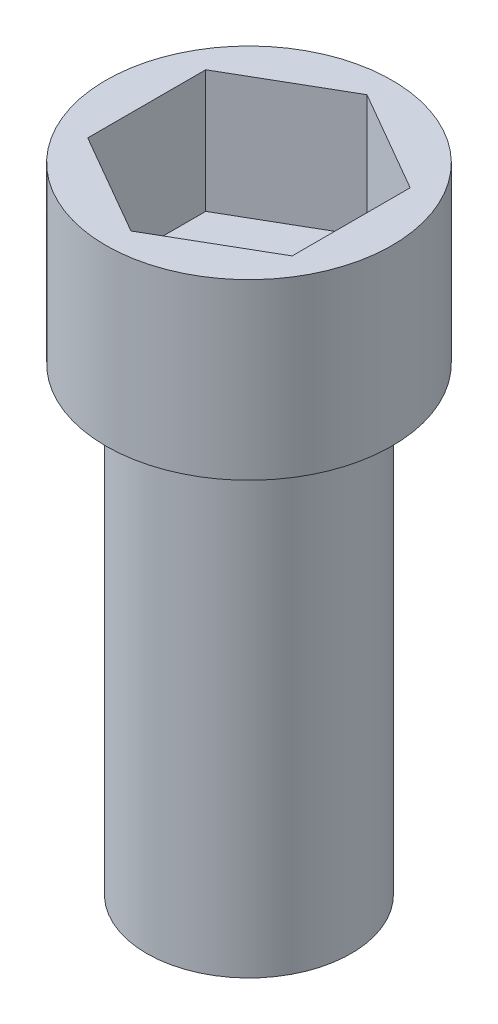
ISO-10303-21;
HEADER;
FILE_DESCRIPTION(('STEP AP214'),'2;1');
FILE_NAME('part.step','',(''),(''),'','','');
FILE_SCHEMA(('AUTOMOTIVE_DESIGN { 1 0 10303 214 1 1 1 1 }'));
ENDSEC;
DATA;
#1=APPLICATION_CONTEXT('core data for automotive mechanical design processes');
#2=APPLICATION_PROTOCOL_DEFINITION('international standard','automotive_design',2000,#1);
#3=PRODUCT_CONTEXT('',#1,'mechanical');
#4=PRODUCT('Part','Part','',(#3));
#5=PRODUCT_RELATED_PRODUCT_CATEGORY('part','',(#4));
#6=PRODUCT_DEFINITION_FORMATION('','',#4);
#7=PRODUCT_DEFINITION_CONTEXT('part definition',#1,'design');
#8=PRODUCT_DEFINITION('design','',#6,#7);
#9=PRODUCT_DEFINITION_SHAPE('','',#8);
#10=(LENGTH_UNIT() NAMED_UNIT(*) SI_UNIT(.MILLI.,.METRE.));
#11=(NAMED_UNIT(*) PLANE_ANGLE_UNIT() SI_UNIT($,.RADIAN.));
#12=(NAMED_UNIT(*) SI_UNIT($,.STERADIAN.) SOLID_ANGLE_UNIT());
#13=UNCERTAINTY_MEASURE_WITH_UNIT(LENGTH_MEASURE(1.E-05),#10,'distance_accuracy_value','');
#14=(GEOMETRIC_REPRESENTATION_CONTEXT(3) GLOBAL_UNCERTAINTY_ASSIGNED_CONTEXT((#13)) GLOBAL_UNIT_ASSIGNED_CONTEXT((#10,
#11,#12)) REPRESENTATION_CONTEXT('',''));
#15=CARTESIAN_POINT('',(0.,0.,0.));
#16=DIRECTION('',(0.,0.,1.));
#17=DIRECTION('',(1.,0.,0.));
#18=AXIS2_PLACEMENT_3D('',#15,#16,#17);
#19=CARTESIAN_POINT('',(0.,17.,0.));
#20=DIRECTION('',(0.,-1.,0.));
#21=DIRECTION('',(0.,0.,-1.));
#22=AXIS2_PLACEMENT_3D('',#19,#20,#21);
#23=CYLINDRICAL_SURFACE('',#22,14.);
#24=CARTESIAN_POINT('',(0.,17.,0.));
#25=DIRECTION('',(0.,1.,0.));
#26=DIRECTION('',(0.,0.,1.));
#27=AXIS2_PLACEMENT_3D('',#24,#25,#26);
#28=CIRCLE('',#27,14.);
#29=CARTESIAN_POINT('',(0.,17.,14.));
#30=VERTEX_POINT('',#29);
#31=EDGE_CURVE('E54',#30,#30,#28,.T.);
#32=ORIENTED_EDGE('',*,*,#31,.F.);
#33=EDGE_LOOP('',(#32));
#34=FACE_BOUND('',#33,.T.);
#35=CARTESIAN_POINT('',(0.,0.,0.));
#36=DIRECTION('',(0.,1.,0.));
#37=DIRECTION('',(0.,0.,1.));
#38=AXIS2_PLACEMENT_3D('',#35,#36,#37);
#39=CIRCLE('',#38,14.);
#40=CARTESIAN_POINT('',(0.,0.,14.));
#41=VERTEX_POINT('',#40);
#42=EDGE_CURVE('E48',#41,#41,#39,.T.);
#43=ORIENTED_EDGE('',*,*,#42,.T.);
#44=EDGE_LOOP('',(#43));
#45=FACE_BOUND('',#44,.T.);
#46=ADVANCED_FACE('F45',(#34,#45),#23,.T.);
#47=CARTESIAN_POINT('',(0.,17.,0.));
#48=DIRECTION('',(0.,1.,0.));
#49=DIRECTION('',(0.,0.,1.));
#50=AXIS2_PLACEMENT_3D('',#47,#48,#49);
#51=PLANE('',#50);
#52=DIRECTION('',(0.,0.,-1.));
#53=VECTOR('',#52,1.);
#54=CARTESIAN_POINT('',(10.,17.,5.77350269189626));
#55=LINE('',#54,#53);
#56=CARTESIAN_POINT('',(10.,17.,5.77350269189626));
#57=VERTEX_POINT('',#56);
#58=CARTESIAN_POINT('',(10.,17.,-5.77350269189626));
#59=VERTEX_POINT('',#58);
#60=EDGE_CURVE('E62',#57,#59,#55,.T.);
#61=ORIENTED_EDGE('',*,*,#60,.F.);
#62=DIRECTION('',(0.866025403784439,0.,-0.5));
#63=VECTOR('',#62,1.);
#64=CARTESIAN_POINT('',(0.,17.,11.5470053837925));
#65=LINE('',#64,#63);
#66=CARTESIAN_POINT('',(0.,17.,11.5470053837925));
#67=VERTEX_POINT('',#66);
#68=EDGE_CURVE('E155',#67,#57,#65,.T.);
#69=ORIENTED_EDGE('',*,*,#68,.F.);
#70=DIRECTION('',(0.866025403784439,0.,0.5));
#71=VECTOR('',#70,1.);
#72=CARTESIAN_POINT('',(-9.99999999999999,17.,5.77350269189626));
#73=LINE('',#72,#71);
#74=CARTESIAN_POINT('',(-9.99999999999999,17.,5.77350269189626));
#75=VERTEX_POINT('',#74);
#76=EDGE_CURVE('E152',#75,#67,#73,.T.);
#77=ORIENTED_EDGE('',*,*,#76,.F.);
#78=DIRECTION('',(0.,0.,1.));
#79=VECTOR('',#78,1.);
#80=CARTESIAN_POINT('',(-9.99999999999999,17.,-5.77350269189626));
#81=LINE('',#80,#79);
#82=CARTESIAN_POINT('',(-9.99999999999999,17.,-5.77350269189626));
#83=VERTEX_POINT('',#82);
#84=EDGE_CURVE('E110',#83,#75,#81,.T.);
#85=ORIENTED_EDGE('',*,*,#84,.F.);
#86=DIRECTION('',(-0.866025403784439,0.,0.5));
#87=VECTOR('',#86,1.);
#88=CARTESIAN_POINT('',(0.,17.,-11.5470053837925));
#89=LINE('',#88,#87);
#90=CARTESIAN_POINT('',(0.,17.,-11.5470053837925));
#91=VERTEX_POINT('',#90);
#92=EDGE_CURVE('E146',#91,#83,#89,.T.);
#93=ORIENTED_EDGE('',*,*,#92,.F.);
#94=DIRECTION('',(-0.866025403784439,0.,-0.5));
#95=VECTOR('',#94,1.);
#96=CARTESIAN_POINT('',(10.,17.,-5.77350269189626));
#97=LINE('',#96,#95);
#98=EDGE_CURVE('E142',#59,#91,#97,.T.);
#99=ORIENTED_EDGE('',*,*,#98,.F.);
#100=EDGE_LOOP('',(#61,#69,#77,#85,#93,#99));
#101=FACE_BOUND('',#100,.T.);
#102=ORIENTED_EDGE('',*,*,#31,.T.);
#103=EDGE_LOOP('',(#102));
#104=FACE_BOUND('',#103,.T.);
#105=ADVANCED_FACE('F185',(#101,#104),#51,.T.);
#106=CARTESIAN_POINT('',(0.,0.,0.));
#107=DIRECTION('',(0.,1.,0.));
#108=DIRECTION('',(0.,0.,1.));
#109=AXIS2_PLACEMENT_3D('',#106,#107,#108);
#110=PLANE('',#109);
#111=CARTESIAN_POINT('',(0.,0.,0.));
#112=DIRECTION('',(0.,-1.,0.));
#113=DIRECTION('',(0.,0.,-1.));
#114=AXIS2_PLACEMENT_3D('',#111,#112,#113);
#115=CIRCLE('',#114,10.);
#116=CARTESIAN_POINT('',(0.,0.,10.));
#117=VERTEX_POINT('',#116);
#118=EDGE_CURVE('E11',#117,#117,#115,.T.);
#119=ORIENTED_EDGE('',*,*,#118,.F.);
#120=EDGE_LOOP('',(#119));
#121=FACE_BOUND('',#120,.T.);
#122=ORIENTED_EDGE('',*,*,#42,.F.);
#123=EDGE_LOOP('',(#122));
#124=FACE_BOUND('',#123,.T.);
#125=ADVANCED_FACE('F182',(#121,#124),#110,.F.);
#126=CARTESIAN_POINT('',(0.,-45.,0.));
#127=DIRECTION('',(0.,1.,0.));
#128=DIRECTION('',(0.,0.,1.));
#129=AXIS2_PLACEMENT_3D('',#126,#127,#128);
#130=CYLINDRICAL_SURFACE('',#129,10.);
#131=CARTESIAN_POINT('',(0.,-45.,0.));
#132=DIRECTION('',(0.,-1.,0.));
#133=DIRECTION('',(0.,0.,-1.));
#134=AXIS2_PLACEMENT_3D('',#131,#132,#133);
#135=CIRCLE('',#134,10.);
#136=CARTESIAN_POINT('',(0.,-45.,10.));
#137=VERTEX_POINT('',#136);
#138=EDGE_CURVE('E161',#137,#137,#135,.T.);
#139=CARTESIAN_POINT('',(0.,-45.,10.));
#140=CARTESIAN_POINT('',(0.,-44.53125,10.));
#141=CARTESIAN_POINT('',(0.,-44.0625,10.));
#142=CARTESIAN_POINT('',(0.,-43.125,10.));
#143=CARTESIAN_POINT('',(0.,-42.65625,10.));
#144=CARTESIAN_POINT('',(0.,-41.71875,10.));
#145=CARTESIAN_POINT('',(0.,-41.25,10.));
#146=CARTESIAN_POINT('',(0.,-40.3125,10.));
#147=CARTESIAN_POINT('',(0.,-39.84375,10.));
#148=CARTESIAN_POINT('',(0.,-38.90625,10.));
#149=CARTESIAN_POINT('',(0.,-38.4375,10.));
#150=CARTESIAN_POINT('',(0.,-37.5,10.));
#151=CARTESIAN_POINT('',(0.,-37.03125,10.));
#152=CARTESIAN_POINT('',(0.,-36.09375,10.));
#153=CARTESIAN_POINT('',(0.,-35.625,10.));
#154=CARTESIAN_POINT('',(0.,-34.6875,10.));
#155=CARTESIAN_POINT('',(0.,-34.21875,10.));
#156=CARTESIAN_POINT('',(0.,-33.28125,10.));
#157=CARTESIAN_POINT('',(0.,-32.8125,10.));
#158=CARTESIAN_POINT('',(0.,-31.875,10.));
#159=CARTESIAN_POINT('',(0.,-31.40625,10.));
#160=CARTESIAN_POINT('',(0.,-30.46875,10.));
#161=CARTESIAN_POINT('',(0.,-30.,10.));
#162=CARTESIAN_POINT('',(0.,-29.0625,10.));
#163=CARTESIAN_POINT('',(0.,-28.59375,10.));
#164=CARTESIAN_POINT('',(0.,-27.65625,10.));
#165=CARTESIAN_POINT('',(0.,-27.1875,10.));
#166=CARTESIAN_POINT('',(0.,-26.25,10.));
#167=CARTESIAN_POINT('',(0.,-25.78125,10.));
#168=CARTESIAN_POINT('',(0.,-24.84375,10.));
#169=CARTESIAN_POINT('',(0.,-24.375,10.));
#170=CARTESIAN_POINT('',(0.,-23.4375,10.));
#171=CARTESIAN_POINT('',(0.,-22.96875,10.));
#172=CARTESIAN_POINT('',(0.,-22.03125,10.));
#173=CARTESIAN_POINT('',(0.,-21.5625,10.));
#174=CARTESIAN_POINT('',(0.,-20.625,10.));
#175=CARTESIAN_POINT('',(0.,-20.15625,10.));
#176=CARTESIAN_POINT('',(0.,-19.21875,10.));
#177=CARTESIAN_POINT('',(0.,-18.75,10.));
#178=CARTESIAN_POINT('',(0.,-17.8125,10.));
#179=CARTESIAN_POINT('',(0.,-17.34375,10.));
#180=CARTESIAN_POINT('',(0.,-16.40625,10.));
#181=CARTESIAN_POINT('',(0.,-15.9375,10.));
#182=CARTESIAN_POINT('',(0.,-15.,10.));
#183=CARTESIAN_POINT('',(0.,-14.53125,10.));
#184=CARTESIAN_POINT('',(0.,-13.59375,10.));
#185=CARTESIAN_POINT('',(0.,-13.125,10.));
#186=CARTESIAN_POINT('',(0.,-12.1875,10.));
#187=CARTESIAN_POINT('',(0.,-11.71875,10.));
#188=CARTESIAN_POINT('',(0.,-10.78125,10.));
#189=CARTESIAN_POINT('',(0.,-10.3125,10.));
#190=CARTESIAN_POINT('',(0.,-9.375,10.));
#191=CARTESIAN_POINT('',(0.,-8.90625,10.));
#192=CARTESIAN_POINT('',(0.,-7.96874999999999,10.));
#193=CARTESIAN_POINT('',(0.,-7.5,10.));
#194=CARTESIAN_POINT('',(0.,-6.5625,10.));
#195=CARTESIAN_POINT('',(0.,-6.09375,10.));
#196=CARTESIAN_POINT('',(0.,-5.15625,10.));
#197=CARTESIAN_POINT('',(0.,-4.68749999999999,10.));
#198=CARTESIAN_POINT('',(0.,-3.74999999999999,10.));
#199=CARTESIAN_POINT('',(0.,-3.28124999999999,10.));
#200=CARTESIAN_POINT('',(0.,-2.34374999999999,10.));
#201=CARTESIAN_POINT('',(0.,-1.87499999999999,10.));
#202=CARTESIAN_POINT('',(0.,-0.937499999999992,10.));
#203=CARTESIAN_POINT('',(0.,-0.468749999999993,10.));
#204=CARTESIAN_POINT('',(0.,0.,10.));
#205=B_SPLINE_CURVE_WITH_KNOTS('',3,(#139,#140,#141,#142,#143,#144,#145,#146,#147,#148,#149,
#150,#151,#152,#153,#154,#155,#156,#157,#158,#159,#160,#161,#162,#163,#164,#165,#166,#167,#168,
#169,#170,#171,#172,#173,#174,#175,#176,#177,#178,#179,#180,#181,#182,#183,#184,#185,#186,#187,
#188,#189,#190,#191,#192,#193,#194,#195,#196,#197,#198,#199,#200,#201,#202,#203,#204),
.UNSPECIFIED.,.F.,.F.,(4,2,2,2,2,2,2,2,2,2,2,2,2,2,2,2,2,2,2,2,2,2,2,2,2,2,2,2,2,2,2,2,4),(0.,
1.40625,2.8125,4.21875000000001,5.62500000000001,7.03125,8.4375,9.84375000000001,11.25,12.65625,
14.0625,15.46875,16.875,18.28125,19.6875,21.09375,22.5,23.90625,25.3125,26.71875,28.125,
29.53125,30.9375,32.34375,33.75,35.15625,36.5625,37.96875,39.375,40.78125,42.1875,43.59375,45.),.UNSPECIFIED.);
#206=EDGE_CURVE('BSEAM184',#137,#117,#205,.T.);
#207=ORIENTED_EDGE('',*,*,#138,.F.);
#208=ORIENTED_EDGE('',*,*,#118,.T.);
#209=ORIENTED_EDGE('',*,*,#206,.T.);
#210=ORIENTED_EDGE('',*,*,#206,.F.);
#211=EDGE_LOOP('',(#207,#209,#208,#210));
#212=FACE_BOUND('',#211,.T.);
#213=ADVANCED_FACE('F184',(#212),#130,.T.);
#214=CARTESIAN_POINT('',(0.,-45.,0.));
#215=DIRECTION('',(0.,-1.,0.));
#216=DIRECTION('',(0.,0.,-1.));
#217=AXIS2_PLACEMENT_3D('',#214,#215,#216);
#218=PLANE('',#217);
#219=ORIENTED_EDGE('',*,*,#138,.T.);
#220=EDGE_LOOP('',(#219));
#221=FACE_BOUND('',#220,.T.);
#222=ADVANCED_FACE('F191',(#221),#218,.T.);
#223=CARTESIAN_POINT('',(10.,5.,5.77350269189626));
#224=DIRECTION('',(1.,0.,0.));
#225=DIRECTION('',(0.,0.,-1.));
#226=AXIS2_PLACEMENT_3D('',#223,#224,#225);
#227=PLANE('',#226);
#228=ORIENTED_EDGE('',*,*,#60,.T.);
#229=DIRECTION('',(0.,1.,0.));
#230=VECTOR('',#229,1.);
#231=CARTESIAN_POINT('',(10.,5.,-5.77350269189626));
#232=LINE('',#231,#230);
#233=CARTESIAN_POINT('',(10.,5.,-5.77350269189626));
#234=VERTEX_POINT('',#233);
#235=EDGE_CURVE('E92',#234,#59,#232,.T.);
#236=ORIENTED_EDGE('',*,*,#235,.F.);
#237=DIRECTION('',(0.,0.,-1.));
#238=VECTOR('',#237,1.);
#239=CARTESIAN_POINT('',(10.,5.,5.77350269189626));
#240=LINE('',#239,#238);
#241=CARTESIAN_POINT('',(10.,5.,5.77350269189626));
#242=VERTEX_POINT('',#241);
#243=EDGE_CURVE('E158',#242,#234,#240,.T.);
#244=ORIENTED_EDGE('',*,*,#243,.F.);
#245=DIRECTION('',(0.,1.,0.));
#246=VECTOR('',#245,1.);
#247=CARTESIAN_POINT('',(10.,5.,5.77350269189626));
#248=LINE('',#247,#246);
#249=EDGE_CURVE('E70',#242,#57,#248,.T.);
#250=ORIENTED_EDGE('',*,*,#249,.T.);
#251=EDGE_LOOP('',(#228,#236,#244,#250));
#252=FACE_BOUND('',#251,.T.);
#253=ADVANCED_FACE('F228',(#252),#227,.F.);
#254=CARTESIAN_POINT('',(0.,5.,11.5470053837925));
#255=DIRECTION('',(0.5,0.,0.866025403784439));
#256=DIRECTION('',(0.866025403784439,0.,-0.5));
#257=AXIS2_PLACEMENT_3D('',#254,#255,#256);
#258=PLANE('',#257);
#259=ORIENTED_EDGE('',*,*,#68,.T.);
#260=ORIENTED_EDGE('',*,*,#249,.F.);
#261=DIRECTION('',(0.866025403784439,0.,-0.5));
#262=VECTOR('',#261,1.);
#263=CARTESIAN_POINT('',(0.,5.,11.5470053837925));
#264=LINE('',#263,#262);
#265=CARTESIAN_POINT('',(0.,5.,11.5470053837925));
#266=VERTEX_POINT('',#265);
#267=EDGE_CURVE('E124',#266,#242,#264,.T.);
#268=ORIENTED_EDGE('',*,*,#267,.F.);
#269=DIRECTION('',(0.,1.,0.));
#270=VECTOR('',#269,1.);
#271=CARTESIAN_POINT('',(0.,5.,11.5470053837925));
#272=LINE('',#271,#270);
#273=EDGE_CURVE('E115',#266,#67,#272,.T.);
#274=ORIENTED_EDGE('',*,*,#273,.T.);
#275=EDGE_LOOP('',(#259,#260,#268,#274));
#276=FACE_BOUND('',#275,.T.);
#277=ADVANCED_FACE('F237',(#276),#258,.F.);
#278=CARTESIAN_POINT('',(-9.99999999999999,5.,5.77350269189626));
#279=DIRECTION('',(-0.5,0.,0.866025403784439));
#280=DIRECTION('',(0.866025403784439,0.,0.5));
#281=AXIS2_PLACEMENT_3D('',#278,#279,#280);
#282=PLANE('',#281);
#283=ORIENTED_EDGE('',*,*,#76,.T.);
#284=ORIENTED_EDGE('',*,*,#273,.F.);
#285=DIRECTION('',(0.866025403784439,0.,0.5));
#286=VECTOR('',#285,1.);
#287=CARTESIAN_POINT('',(-9.99999999999999,5.,5.77350269189626));
#288=LINE('',#287,#286);
#289=CARTESIAN_POINT('',(-9.99999999999999,5.,5.77350269189626));
#290=VERTEX_POINT('',#289);
#291=EDGE_CURVE('E119',#290,#266,#288,.T.);
#292=ORIENTED_EDGE('',*,*,#291,.F.);
#293=DIRECTION('',(0.,1.,0.));
#294=VECTOR('',#293,1.);
#295=CARTESIAN_POINT('',(-9.99999999999999,5.,5.77350269189626));
#296=LINE('',#295,#294);
#297=EDGE_CURVE('E103',#290,#75,#296,.T.);
#298=ORIENTED_EDGE('',*,*,#297,.T.);
#299=EDGE_LOOP('',(#283,#284,#292,#298));
#300=FACE_BOUND('',#299,.T.);
#301=ADVANCED_FACE('F120',(#300),#282,.F.);
#302=CARTESIAN_POINT('',(-9.99999999999999,5.,-5.77350269189626));
#303=DIRECTION('',(-1.,0.,0.));
#304=DIRECTION('',(0.,0.,1.));
#305=AXIS2_PLACEMENT_3D('',#302,#303,#304);
#306=PLANE('',#305);
#307=ORIENTED_EDGE('',*,*,#84,.T.);
#308=ORIENTED_EDGE('',*,*,#297,.F.);
#309=DIRECTION('',(0.,0.,1.));
#310=VECTOR('',#309,1.);
#311=CARTESIAN_POINT('',(-9.99999999999999,5.,-5.77350269189626));
#312=LINE('',#311,#310);
#313=CARTESIAN_POINT('',(-9.99999999999999,5.,-5.77350269189626));
#314=VERTEX_POINT('',#313);
#315=EDGE_CURVE('E107',#314,#290,#312,.T.);
#316=ORIENTED_EDGE('',*,*,#315,.F.);
#317=DIRECTION('',(0.,1.,0.));
#318=VECTOR('',#317,1.);
#319=CARTESIAN_POINT('',(-9.99999999999999,5.,-5.77350269189626));
#320=LINE('',#319,#318);
#321=EDGE_CURVE('E116',#314,#83,#320,.T.);
#322=ORIENTED_EDGE('',*,*,#321,.T.);
#323=EDGE_LOOP('',(#307,#308,#316,#322));
#324=FACE_BOUND('',#323,.T.);
#325=ADVANCED_FACE('F105',(#324),#306,.F.);
#326=CARTESIAN_POINT('',(0.,5.,-11.5470053837925));
#327=DIRECTION('',(-0.5,0.,-0.866025403784439));
#328=DIRECTION('',(-0.866025403784439,0.,0.5));
#329=AXIS2_PLACEMENT_3D('',#326,#327,#328);
#330=PLANE('',#329);
#331=ORIENTED_EDGE('',*,*,#92,.T.);
#332=ORIENTED_EDGE('',*,*,#321,.F.);
#333=DIRECTION('',(-0.866025403784439,0.,0.5));
#334=VECTOR('',#333,1.);
#335=CARTESIAN_POINT('',(0.,5.,-11.5470053837925));
#336=LINE('',#335,#334);
#337=CARTESIAN_POINT('',(0.,5.,-11.5470053837925));
#338=VERTEX_POINT('',#337);
#339=EDGE_CURVE('E130',#338,#314,#336,.T.);
#340=ORIENTED_EDGE('',*,*,#339,.F.);
#341=DIRECTION('',(0.,1.,0.));
#342=VECTOR('',#341,1.);
#343=CARTESIAN_POINT('',(0.,5.,-11.5470053837925));
#344=LINE('',#343,#342);
#345=EDGE_CURVE('E166',#338,#91,#344,.T.);
#346=ORIENTED_EDGE('',*,*,#345,.T.);
#347=EDGE_LOOP('',(#331,#332,#340,#346));
#348=FACE_BOUND('',#347,.T.);
#349=ADVANCED_FACE('F262',(#348),#330,.F.);
#350=CARTESIAN_POINT('',(10.,5.,-5.77350269189626));
#351=DIRECTION('',(0.5,0.,-0.866025403784438));
#352=DIRECTION('',(-0.866025403784439,0.,-0.5));
#353=AXIS2_PLACEMENT_3D('',#350,#351,#352);
#354=PLANE('',#353);
#355=ORIENTED_EDGE('',*,*,#98,.T.);
#356=ORIENTED_EDGE('',*,*,#345,.F.);
#357=DIRECTION('',(-0.866025403784439,0.,-0.5));
#358=VECTOR('',#357,1.);
#359=CARTESIAN_POINT('',(10.,5.,-5.77350269189626));
#360=LINE('',#359,#358);
#361=EDGE_CURVE('E134',#234,#338,#360,.T.);
#362=ORIENTED_EDGE('',*,*,#361,.F.);
#363=ORIENTED_EDGE('',*,*,#235,.T.);
#364=EDGE_LOOP('',(#355,#356,#362,#363));
#365=FACE_BOUND('',#364,.T.);
#366=ADVANCED_FACE('F271',(#365),#354,.F.);
#367=CARTESIAN_POINT('',(0.,5.,0.));
#368=DIRECTION('',(0.,1.,0.));
#369=DIRECTION('',(0.,0.,1.));
#370=AXIS2_PLACEMENT_3D('',#367,#368,#369);
#371=PLANE('',#370);
#372=ORIENTED_EDGE('',*,*,#243,.T.);
#373=ORIENTED_EDGE('',*,*,#361,.T.);
#374=ORIENTED_EDGE('',*,*,#339,.T.);
#375=ORIENTED_EDGE('',*,*,#315,.T.);
#376=ORIENTED_EDGE('',*,*,#291,.T.);
#377=ORIENTED_EDGE('',*,*,#267,.T.);
#378=EDGE_LOOP('',(#372,#373,#374,#375,#376,#377));
#379=FACE_BOUND('',#378,.T.);
#380=ADVANCED_FACE('F127',(#379),#371,.T.);
#381=CLOSED_SHELL('',(#46,#105,#125,#213,#222,#253,#277,#301,#325,#349,#366,#380));
#382=MANIFOLD_SOLID_BREP('B2',#381);
#383=ADVANCED_BREP_SHAPE_REPRESENTATION('',(#18,#382),#14);
#384=SHAPE_DEFINITION_REPRESENTATION(#9,#383);
ENDSEC;
END-ISO-10303-21;
